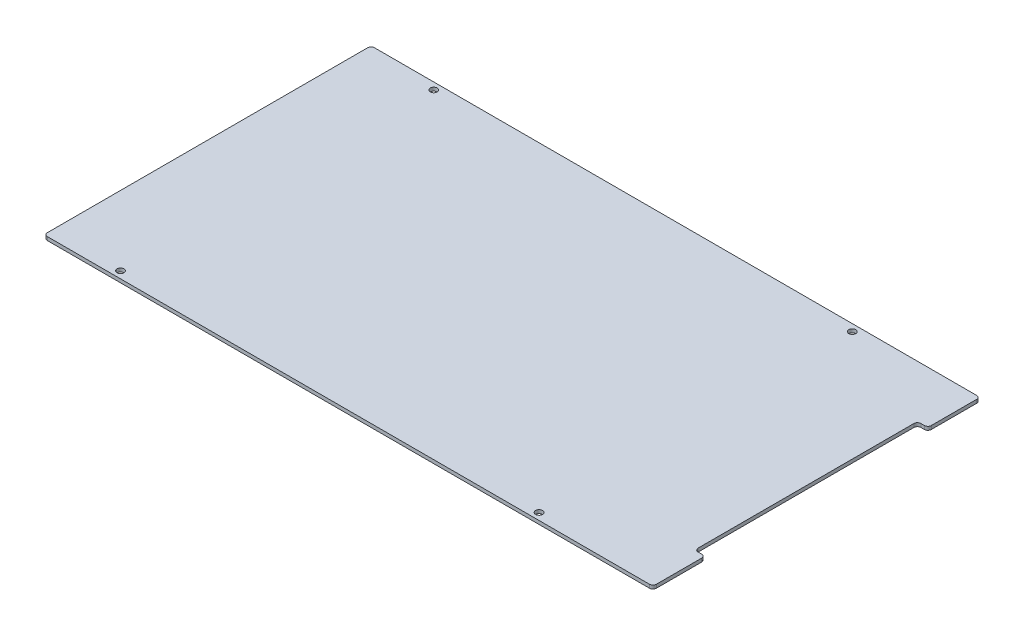
ISO-10303-21;
HEADER;
FILE_DESCRIPTION(('STEP AP214'),'2;1');
FILE_NAME('part.step','',(''),(''),'','','');
FILE_SCHEMA(('AUTOMOTIVE_DESIGN { 1 0 10303 214 1 1 1 1 }'));
ENDSEC;
DATA;
#1=APPLICATION_CONTEXT('core data for automotive mechanical design processes');
#2=APPLICATION_PROTOCOL_DEFINITION('international standard','automotive_design',2000,#1);
#3=PRODUCT_CONTEXT('',#1,'mechanical');
#4=PRODUCT('Part','Part','',(#3));
#5=PRODUCT_RELATED_PRODUCT_CATEGORY('part','',(#4));
#6=PRODUCT_DEFINITION_FORMATION('','',#4);
#7=PRODUCT_DEFINITION_CONTEXT('part definition',#1,'design');
#8=PRODUCT_DEFINITION('design','',#6,#7);
#9=PRODUCT_DEFINITION_SHAPE('','',#8);
#10=(LENGTH_UNIT() NAMED_UNIT(*) SI_UNIT(.MILLI.,.METRE.));
#11=(NAMED_UNIT(*) PLANE_ANGLE_UNIT() SI_UNIT($,.RADIAN.));
#12=(NAMED_UNIT(*) SI_UNIT($,.STERADIAN.) SOLID_ANGLE_UNIT());
#13=UNCERTAINTY_MEASURE_WITH_UNIT(LENGTH_MEASURE(1.E-05),#10,'distance_accuracy_value','');
#14=(GEOMETRIC_REPRESENTATION_CONTEXT(3) GLOBAL_UNCERTAINTY_ASSIGNED_CONTEXT((#13)) GLOBAL_UNIT_ASSIGNED_CONTEXT((#10,
#11,#12)) REPRESENTATION_CONTEXT('',''));
#15=CARTESIAN_POINT('',(0.,0.,0.));
#16=DIRECTION('',(0.,0.,1.));
#17=DIRECTION('',(1.,0.,0.));
#18=AXIS2_PLACEMENT_3D('',#15,#16,#17);
#19=CARTESIAN_POINT('',(277.8125,3.175,149.225));
#20=DIRECTION('',(-1.,0.,0.));
#21=DIRECTION('',(0.,0.,1.));
#22=AXIS2_PLACEMENT_3D('',#19,#20,#21);
#23=PLANE('',#22);
#24=DIRECTION('',(0.,0.,-1.));
#25=VECTOR('',#24,1.);
#26=CARTESIAN_POINT('',(277.8125,0.,149.225));
#27=LINE('',#26,#25);
#28=CARTESIAN_POINT('',(277.8125,0.,146.05));
#29=VERTEX_POINT('',#28);
#30=CARTESIAN_POINT('',(277.8125,0.,104.775));
#31=VERTEX_POINT('',#30);
#32=EDGE_CURVE('E205',#29,#31,#27,.T.);
#33=ORIENTED_EDGE('',*,*,#32,.T.);
#34=DIRECTION('',(0.,1.,0.));
#35=VECTOR('',#34,1.);
#36=CARTESIAN_POINT('',(277.8125,3.175,104.775));
#37=LINE('',#36,#35);
#38=CARTESIAN_POINT('',(277.8125,3.175,104.775));
#39=VERTEX_POINT('',#38);
#40=EDGE_CURVE('E258',#31,#39,#37,.T.);
#41=ORIENTED_EDGE('',*,*,#40,.T.);
#42=DIRECTION('',(0.,0.,-1.));
#43=VECTOR('',#42,1.);
#44=CARTESIAN_POINT('',(277.8125,3.175,149.225));
#45=LINE('',#44,#43);
#46=CARTESIAN_POINT('',(277.8125,3.175,146.05));
#47=VERTEX_POINT('',#46);
#48=EDGE_CURVE('E195',#47,#39,#45,.T.);
#49=ORIENTED_EDGE('',*,*,#48,.F.);
#50=DIRECTION('',(0.,-1.,0.));
#51=VECTOR('',#50,1.);
#52=CARTESIAN_POINT('',(277.8125,3.175,146.05));
#53=LINE('',#52,#51);
#54=EDGE_CURVE('E255',#47,#29,#53,.T.);
#55=ORIENTED_EDGE('',*,*,#54,.T.);
#56=EDGE_LOOP('',(#33,#41,#49,#55));
#57=FACE_BOUND('',#56,.T.);
#58=ADVANCED_FACE('F41',(#57),#23,.F.);
#59=CARTESIAN_POINT('',(277.8125,3.175,-104.775));
#60=VERTEX_POINT('',#59);
#61=CARTESIAN_POINT('',(277.8125,3.175,-146.05));
#62=VERTEX_POINT('',#61);
#63=EDGE_CURVE('E192',#60,#62,#45,.T.);
#64=ORIENTED_EDGE('',*,*,#63,.F.);
#65=DIRECTION('',(0.,1.,0.));
#66=VECTOR('',#65,1.);
#67=CARTESIAN_POINT('',(277.8125,3.175,-104.775));
#68=LINE('',#67,#66);
#69=CARTESIAN_POINT('',(277.8125,0.,-104.775));
#70=VERTEX_POINT('',#69);
#71=EDGE_CURVE('E243',#60,#70,#68,.F.);
#72=ORIENTED_EDGE('',*,*,#71,.T.);
#73=CARTESIAN_POINT('',(277.8125,0.,-146.05));
#74=VERTEX_POINT('',#73);
#75=EDGE_CURVE('E209',#70,#74,#27,.T.);
#76=ORIENTED_EDGE('',*,*,#75,.T.);
#77=DIRECTION('',(0.,-1.,0.));
#78=VECTOR('',#77,1.);
#79=CARTESIAN_POINT('',(277.8125,3.175,-146.05));
#80=LINE('',#79,#78);
#81=EDGE_CURVE('E241',#74,#62,#80,.F.);
#82=ORIENTED_EDGE('',*,*,#81,.T.);
#83=EDGE_LOOP('',(#64,#72,#76,#82));
#84=FACE_BOUND('',#83,.T.);
#85=ADVANCED_FACE('F308',(#84),#23,.F.);
#86=CARTESIAN_POINT('',(-277.8125,3.175,-149.225));
#87=DIRECTION('',(0.,0.,1.));
#88=DIRECTION('',(1.,0.,0.));
#89=AXIS2_PLACEMENT_3D('',#86,#87,#88);
#90=PLANE('',#89);
#91=DIRECTION('',(-1.,0.,0.));
#92=VECTOR('',#91,1.);
#93=CARTESIAN_POINT('',(-277.8125,3.175,-149.225));
#94=LINE('',#93,#92);
#95=CARTESIAN_POINT('',(274.6375,3.175,-149.225));
#96=VERTEX_POINT('',#95);
#97=CARTESIAN_POINT('',(-274.6375,3.175,-149.225));
#98=VERTEX_POINT('',#97);
#99=EDGE_CURVE('E197',#96,#98,#94,.T.);
#100=ORIENTED_EDGE('',*,*,#99,.F.);
#101=DIRECTION('',(0.,-1.,0.));
#102=VECTOR('',#101,1.);
#103=CARTESIAN_POINT('',(274.6375,3.175,-149.225));
#104=LINE('',#103,#102);
#105=CARTESIAN_POINT('',(274.6375,0.,-149.225));
#106=VERTEX_POINT('',#105);
#107=EDGE_CURVE('E265',#96,#106,#104,.T.);
#108=ORIENTED_EDGE('',*,*,#107,.T.);
#109=DIRECTION('',(-1.,0.,0.));
#110=VECTOR('',#109,1.);
#111=CARTESIAN_POINT('',(-277.8125,0.,-149.225));
#112=LINE('',#111,#110);
#113=CARTESIAN_POINT('',(-274.6375,0.,-149.225));
#114=VERTEX_POINT('',#113);
#115=EDGE_CURVE('E208',#106,#114,#112,.T.);
#116=ORIENTED_EDGE('',*,*,#115,.T.);
#117=DIRECTION('',(0.,-1.,0.));
#118=VECTOR('',#117,1.);
#119=CARTESIAN_POINT('',(-274.6375,3.175,-149.225));
#120=LINE('',#119,#118);
#121=EDGE_CURVE('E263',#114,#98,#120,.F.);
#122=ORIENTED_EDGE('',*,*,#121,.T.);
#123=EDGE_LOOP('',(#100,#108,#116,#122));
#124=FACE_BOUND('',#123,.T.);
#125=ADVANCED_FACE('F301',(#124),#90,.F.);
#126=CARTESIAN_POINT('',(-277.8125,3.175,149.225));
#127=DIRECTION('',(1.,0.,0.));
#128=DIRECTION('',(0.,0.,-1.));
#129=AXIS2_PLACEMENT_3D('',#126,#127,#128);
#130=PLANE('',#129);
#131=DIRECTION('',(0.,0.,1.));
#132=VECTOR('',#131,1.);
#133=CARTESIAN_POINT('',(-277.8125,3.175,149.225));
#134=LINE('',#133,#132);
#135=CARTESIAN_POINT('',(-277.8125,3.175,-146.05));
#136=VERTEX_POINT('',#135);
#137=CARTESIAN_POINT('',(-277.8125,3.175,146.05));
#138=VERTEX_POINT('',#137);
#139=EDGE_CURVE('E200',#136,#138,#134,.T.);
#140=ORIENTED_EDGE('',*,*,#139,.F.);
#141=DIRECTION('',(0.,-1.,0.));
#142=VECTOR('',#141,1.);
#143=CARTESIAN_POINT('',(-277.8125,3.175,-146.05));
#144=LINE('',#143,#142);
#145=CARTESIAN_POINT('',(-277.8125,0.,-146.05));
#146=VERTEX_POINT('',#145);
#147=EDGE_CURVE('E269',#136,#146,#144,.T.);
#148=ORIENTED_EDGE('',*,*,#147,.T.);
#149=DIRECTION('',(0.,0.,1.));
#150=VECTOR('',#149,1.);
#151=CARTESIAN_POINT('',(-277.8125,0.,149.225));
#152=LINE('',#151,#150);
#153=CARTESIAN_POINT('',(-277.8125,0.,146.05));
#154=VERTEX_POINT('',#153);
#155=EDGE_CURVE('E211',#146,#154,#152,.T.);
#156=ORIENTED_EDGE('',*,*,#155,.T.);
#157=DIRECTION('',(0.,-1.,0.));
#158=VECTOR('',#157,1.);
#159=CARTESIAN_POINT('',(-277.8125,3.175,146.05));
#160=LINE('',#159,#158);
#161=EDGE_CURVE('E267',#154,#138,#160,.F.);
#162=ORIENTED_EDGE('',*,*,#161,.T.);
#163=EDGE_LOOP('',(#140,#148,#156,#162));
#164=FACE_BOUND('',#163,.T.);
#165=ADVANCED_FACE('F293',(#164),#130,.F.);
#166=CARTESIAN_POINT('',(-277.8125,3.175,149.225));
#167=DIRECTION('',(0.,0.,-1.));
#168=DIRECTION('',(-1.,0.,0.));
#169=AXIS2_PLACEMENT_3D('',#166,#167,#168);
#170=PLANE('',#169);
#171=DIRECTION('',(1.,0.,0.));
#172=VECTOR('',#171,1.);
#173=CARTESIAN_POINT('',(-277.8125,0.,149.225));
#174=LINE('',#173,#172);
#175=CARTESIAN_POINT('',(-274.6375,0.,149.225));
#176=VERTEX_POINT('',#175);
#177=CARTESIAN_POINT('',(274.6375,0.,149.225));
#178=VERTEX_POINT('',#177);
#179=EDGE_CURVE('E196',#176,#178,#174,.T.);
#180=ORIENTED_EDGE('',*,*,#179,.T.);
#181=DIRECTION('',(0.,-1.,0.));
#182=VECTOR('',#181,1.);
#183=CARTESIAN_POINT('',(274.6375,3.175,149.225));
#184=LINE('',#183,#182);
#185=CARTESIAN_POINT('',(274.6375,3.175,149.225));
#186=VERTEX_POINT('',#185);
#187=EDGE_CURVE('E11',#178,#186,#184,.F.);
#188=ORIENTED_EDGE('',*,*,#187,.T.);
#189=DIRECTION('',(1.,0.,0.));
#190=VECTOR('',#189,1.);
#191=CARTESIAN_POINT('',(-277.8125,3.175,149.225));
#192=LINE('',#191,#190);
#193=CARTESIAN_POINT('',(-274.6375,3.175,149.225));
#194=VERTEX_POINT('',#193);
#195=EDGE_CURVE('E177',#194,#186,#192,.T.);
#196=ORIENTED_EDGE('',*,*,#195,.F.);
#197=DIRECTION('',(0.,-1.,0.));
#198=VECTOR('',#197,1.);
#199=CARTESIAN_POINT('',(-274.6375,3.175,149.225));
#200=LINE('',#199,#198);
#201=EDGE_CURVE('E49',#194,#176,#200,.T.);
#202=ORIENTED_EDGE('',*,*,#201,.T.);
#203=EDGE_LOOP('',(#180,#188,#196,#202));
#204=FACE_BOUND('',#203,.T.);
#205=ADVANCED_FACE('F276',(#204),#170,.F.);
#206=CARTESIAN_POINT('',(0.,3.175,0.));
#207=DIRECTION('',(0.,-1.,0.));
#208=DIRECTION('',(0.,0.,-1.));
#209=AXIS2_PLACEMENT_3D('',#206,#207,#208);
#210=PLANE('',#209);
#211=CARTESIAN_POINT('',(167.5765,3.175,-142.875));
#212=DIRECTION('',(0.,-1.,0.));
#213=DIRECTION('',(0.,0.,-1.));
#214=AXIS2_PLACEMENT_3D('',#211,#212,#213);
#215=CIRCLE('',#214,3.17500000000001);
#216=CARTESIAN_POINT('',(167.5765,3.175,-146.05));
#217=VERTEX_POINT('',#216);
#218=EDGE_CURVE('E336',#217,#217,#215,.T.);
#219=ORIENTED_EDGE('',*,*,#218,.T.);
#220=EDGE_LOOP('',(#219));
#221=FACE_BOUND('',#220,.T.);
#222=CARTESIAN_POINT('',(-214.3125,3.175,-142.875));
#223=DIRECTION('',(0.,-1.,0.));
#224=DIRECTION('',(0.,0.,-1.));
#225=AXIS2_PLACEMENT_3D('',#222,#223,#224);
#226=CIRCLE('',#225,3.17500000000001);
#227=CARTESIAN_POINT('',(-214.3125,3.175,-146.05));
#228=VERTEX_POINT('',#227);
#229=EDGE_CURVE('E330',#228,#228,#226,.T.);
#230=ORIENTED_EDGE('',*,*,#229,.T.);
#231=EDGE_LOOP('',(#230));
#232=FACE_BOUND('',#231,.T.);
#233=CARTESIAN_POINT('',(167.5765,3.175,142.875));
#234=DIRECTION('',(0.,-1.,0.));
#235=DIRECTION('',(0.,0.,-1.));
#236=AXIS2_PLACEMENT_3D('',#233,#234,#235);
#237=CIRCLE('',#236,3.17500000000001);
#238=CARTESIAN_POINT('',(167.5765,3.175,139.7));
#239=VERTEX_POINT('',#238);
#240=EDGE_CURVE('E322',#239,#239,#237,.T.);
#241=ORIENTED_EDGE('',*,*,#240,.T.);
#242=EDGE_LOOP('',(#241));
#243=FACE_BOUND('',#242,.T.);
#244=CARTESIAN_POINT('',(-214.3125,3.175,142.875));
#245=DIRECTION('',(0.,-1.,0.));
#246=DIRECTION('',(0.,0.,-1.));
#247=AXIS2_PLACEMENT_3D('',#244,#245,#246);
#248=CIRCLE('',#247,3.17500000000001);
#249=CARTESIAN_POINT('',(-214.3125,3.175,139.7));
#250=VERTEX_POINT('',#249);
#251=EDGE_CURVE('E314',#250,#250,#248,.T.);
#252=ORIENTED_EDGE('',*,*,#251,.T.);
#253=EDGE_LOOP('',(#252));
#254=FACE_BOUND('',#253,.T.);
#255=DIRECTION('',(-1.,0.,0.));
#256=VECTOR('',#255,1.);
#257=CARTESIAN_POINT('',(277.8125,3.175,-101.6));
#258=LINE('',#257,#256);
#259=CARTESIAN_POINT('',(274.6375,3.175,-101.6));
#260=VERTEX_POINT('',#259);
#261=CARTESIAN_POINT('',(271.4625,3.175,-101.6));
#262=VERTEX_POINT('',#261);
#263=EDGE_CURVE('E188',#260,#262,#258,.T.);
#264=ORIENTED_EDGE('',*,*,#263,.F.);
#265=CARTESIAN_POINT('',(274.6375,3.175,-104.775));
#266=DIRECTION('',(0.,-1.,0.));
#267=DIRECTION('',(0.,0.,-1.));
#268=AXIS2_PLACEMENT_3D('',#265,#266,#267);
#269=CIRCLE('',#268,3.175);
#270=EDGE_CURVE('E239',#260,#60,#269,.F.);
#271=ORIENTED_EDGE('',*,*,#270,.T.);
#272=ORIENTED_EDGE('',*,*,#63,.T.);
#273=CARTESIAN_POINT('',(274.6375,3.175,-146.05));
#274=DIRECTION('',(0.,-1.,0.));
#275=DIRECTION('',(0.,0.,-1.));
#276=AXIS2_PLACEMENT_3D('',#273,#274,#275);
#277=CIRCLE('',#276,3.175);
#278=EDGE_CURVE('E236',#62,#96,#277,.F.);
#279=ORIENTED_EDGE('',*,*,#278,.T.);
#280=ORIENTED_EDGE('',*,*,#99,.T.);
#281=CARTESIAN_POINT('',(-274.6375,3.175,-146.05));
#282=DIRECTION('',(0.,-1.,0.));
#283=DIRECTION('',(0.,0.,-1.));
#284=AXIS2_PLACEMENT_3D('',#281,#282,#283);
#285=CIRCLE('',#284,3.175);
#286=EDGE_CURVE('E234',#98,#136,#285,.F.);
#287=ORIENTED_EDGE('',*,*,#286,.T.);
#288=ORIENTED_EDGE('',*,*,#139,.T.);
#289=CARTESIAN_POINT('',(-274.6375,3.175,146.05));
#290=DIRECTION('',(0.,-1.,0.));
#291=DIRECTION('',(0.,0.,-1.));
#292=AXIS2_PLACEMENT_3D('',#289,#290,#291);
#293=CIRCLE('',#292,3.175);
#294=EDGE_CURVE('E230',#138,#194,#293,.F.);
#295=ORIENTED_EDGE('',*,*,#294,.T.);
#296=ORIENTED_EDGE('',*,*,#195,.T.);
#297=CARTESIAN_POINT('',(274.6375,3.175,146.05));
#298=DIRECTION('',(0.,-1.,0.));
#299=DIRECTION('',(0.,0.,-1.));
#300=AXIS2_PLACEMENT_3D('',#297,#298,#299);
#301=CIRCLE('',#300,3.175);
#302=EDGE_CURVE('E232',#186,#47,#301,.F.);
#303=ORIENTED_EDGE('',*,*,#302,.T.);
#304=ORIENTED_EDGE('',*,*,#48,.T.);
#305=CARTESIAN_POINT('',(274.6375,3.175,104.775));
#306=DIRECTION('',(0.,-1.,0.));
#307=DIRECTION('',(0.,0.,-1.));
#308=AXIS2_PLACEMENT_3D('',#305,#306,#307);
#309=CIRCLE('',#308,3.175);
#310=CARTESIAN_POINT('',(274.6375,3.175,101.6));
#311=VERTEX_POINT('',#310);
#312=EDGE_CURVE('E182',#39,#311,#309,.F.);
#313=ORIENTED_EDGE('',*,*,#312,.T.);
#314=DIRECTION('',(1.,0.,0.));
#315=VECTOR('',#314,1.);
#316=CARTESIAN_POINT('',(277.8125,3.175,101.6));
#317=LINE('',#316,#315);
#318=CARTESIAN_POINT('',(271.4625,3.175,101.6));
#319=VERTEX_POINT('',#318);
#320=EDGE_CURVE('E172',#319,#311,#317,.T.);
#321=ORIENTED_EDGE('',*,*,#320,.F.);
#322=CARTESIAN_POINT('',(271.4625,3.175,98.425));
#323=DIRECTION('',(0.,-1.,0.));
#324=DIRECTION('',(0.,0.,-1.));
#325=AXIS2_PLACEMENT_3D('',#322,#323,#324);
#326=CIRCLE('',#325,3.175);
#327=CARTESIAN_POINT('',(268.2875,3.175,98.425));
#328=VERTEX_POINT('',#327);
#329=EDGE_CURVE('E155',#319,#328,#326,.T.);
#330=ORIENTED_EDGE('',*,*,#329,.T.);
#331=DIRECTION('',(0.,0.,1.));
#332=VECTOR('',#331,1.);
#333=CARTESIAN_POINT('',(268.2875,3.175,-101.6));
#334=LINE('',#333,#332);
#335=CARTESIAN_POINT('',(268.2875,3.175,-98.425));
#336=VERTEX_POINT('',#335);
#337=EDGE_CURVE('E184',#336,#328,#334,.T.);
#338=ORIENTED_EDGE('',*,*,#337,.F.);
#339=CARTESIAN_POINT('',(271.4625,3.175,-98.425));
#340=DIRECTION('',(0.,-1.,0.));
#341=DIRECTION('',(0.,0.,-1.));
#342=AXIS2_PLACEMENT_3D('',#339,#340,#341);
#343=CIRCLE('',#342,3.175);
#344=EDGE_CURVE('E222',#336,#262,#343,.T.);
#345=ORIENTED_EDGE('',*,*,#344,.T.);
#346=EDGE_LOOP('',(#264,#271,#272,#279,#280,#287,#288,#295,#296,#303,#304,#313,#321,#330,#338,#345));
#347=FACE_BOUND('',#346,.T.);
#348=ADVANCED_FACE('F180',(#221,#232,#243,#254,#347),#210,.F.);
#349=CARTESIAN_POINT('',(0.,0.,0.));
#350=DIRECTION('',(0.,-1.,0.));
#351=DIRECTION('',(0.,0.,-1.));
#352=AXIS2_PLACEMENT_3D('',#349,#350,#351);
#353=PLANE('',#352);
#354=CARTESIAN_POINT('',(167.5765,0.,-142.875));
#355=DIRECTION('',(0.,-1.,0.));
#356=DIRECTION('',(0.,0.,-1.));
#357=AXIS2_PLACEMENT_3D('',#354,#355,#356);
#358=CIRCLE('',#357,3.17499999999998);
#359=CARTESIAN_POINT('',(167.5765,0.,-146.05));
#360=VERTEX_POINT('',#359);
#361=EDGE_CURVE('E339',#360,#360,#358,.T.);
#362=ORIENTED_EDGE('',*,*,#361,.F.);
#363=EDGE_LOOP('',(#362));
#364=FACE_BOUND('',#363,.T.);
#365=CARTESIAN_POINT('',(-214.3125,0.,-142.875));
#366=DIRECTION('',(0.,-1.,0.));
#367=DIRECTION('',(0.,0.,-1.));
#368=AXIS2_PLACEMENT_3D('',#365,#366,#367);
#369=CIRCLE('',#368,3.17499999999998);
#370=CARTESIAN_POINT('',(-214.3125,0.,-146.05));
#371=VERTEX_POINT('',#370);
#372=EDGE_CURVE('E333',#371,#371,#369,.T.);
#373=ORIENTED_EDGE('',*,*,#372,.F.);
#374=EDGE_LOOP('',(#373));
#375=FACE_BOUND('',#374,.T.);
#376=CARTESIAN_POINT('',(167.5765,0.,142.875));
#377=DIRECTION('',(0.,-1.,0.));
#378=DIRECTION('',(0.,0.,-1.));
#379=AXIS2_PLACEMENT_3D('',#376,#377,#378);
#380=CIRCLE('',#379,3.17499999999998);
#381=CARTESIAN_POINT('',(167.5765,0.,139.7));
#382=VERTEX_POINT('',#381);
#383=EDGE_CURVE('E327',#382,#382,#380,.T.);
#384=ORIENTED_EDGE('',*,*,#383,.F.);
#385=EDGE_LOOP('',(#384));
#386=FACE_BOUND('',#385,.T.);
#387=CARTESIAN_POINT('',(-214.3125,0.,142.875));
#388=DIRECTION('',(0.,-1.,0.));
#389=DIRECTION('',(0.,0.,-1.));
#390=AXIS2_PLACEMENT_3D('',#387,#388,#389);
#391=CIRCLE('',#390,3.17499999999998);
#392=CARTESIAN_POINT('',(-214.3125,0.,139.7));
#393=VERTEX_POINT('',#392);
#394=EDGE_CURVE('E317',#393,#393,#391,.T.);
#395=ORIENTED_EDGE('',*,*,#394,.F.);
#396=EDGE_LOOP('',(#395));
#397=FACE_BOUND('',#396,.T.);
#398=ORIENTED_EDGE('',*,*,#75,.F.);
#399=CARTESIAN_POINT('',(274.6375,0.,-104.775));
#400=DIRECTION('',(0.,-1.,0.));
#401=DIRECTION('',(0.,0.,-1.));
#402=AXIS2_PLACEMENT_3D('',#399,#400,#401);
#403=CIRCLE('',#402,3.175);
#404=CARTESIAN_POINT('',(274.6375,0.,-101.6));
#405=VERTEX_POINT('',#404);
#406=EDGE_CURVE('E253',#70,#405,#403,.T.);
#407=ORIENTED_EDGE('',*,*,#406,.T.);
#408=DIRECTION('',(-1.,0.,0.));
#409=VECTOR('',#408,1.);
#410=CARTESIAN_POINT('',(277.8125,0.,-101.6));
#411=LINE('',#410,#409);
#412=CARTESIAN_POINT('',(271.4625,0.,-101.6));
#413=VERTEX_POINT('',#412);
#414=EDGE_CURVE('E183',#405,#413,#411,.T.);
#415=ORIENTED_EDGE('',*,*,#414,.T.);
#416=CARTESIAN_POINT('',(271.4625,0.,-98.425));
#417=DIRECTION('',(0.,-1.,0.));
#418=DIRECTION('',(0.,0.,-1.));
#419=AXIS2_PLACEMENT_3D('',#416,#417,#418);
#420=CIRCLE('',#419,3.175);
#421=CARTESIAN_POINT('',(268.2875,0.,-98.425));
#422=VERTEX_POINT('',#421);
#423=EDGE_CURVE('E225',#413,#422,#420,.F.);
#424=ORIENTED_EDGE('',*,*,#423,.T.);
#425=DIRECTION('',(0.,0.,1.));
#426=VECTOR('',#425,1.);
#427=CARTESIAN_POINT('',(268.2875,0.,-101.6));
#428=LINE('',#427,#426);
#429=CARTESIAN_POINT('',(268.2875,0.,98.425));
#430=VERTEX_POINT('',#429);
#431=EDGE_CURVE('E186',#422,#430,#428,.T.);
#432=ORIENTED_EDGE('',*,*,#431,.T.);
#433=CARTESIAN_POINT('',(271.4625,0.,98.425));
#434=DIRECTION('',(0.,-1.,0.));
#435=DIRECTION('',(0.,0.,-1.));
#436=AXIS2_PLACEMENT_3D('',#433,#434,#435);
#437=CIRCLE('',#436,3.175);
#438=CARTESIAN_POINT('',(271.4625,0.,101.6));
#439=VERTEX_POINT('',#438);
#440=EDGE_CURVE('E165',#430,#439,#437,.F.);
#441=ORIENTED_EDGE('',*,*,#440,.T.);
#442=DIRECTION('',(1.,0.,0.));
#443=VECTOR('',#442,1.);
#444=CARTESIAN_POINT('',(277.8125,0.,101.6));
#445=LINE('',#444,#443);
#446=CARTESIAN_POINT('',(274.6375,0.,101.6));
#447=VERTEX_POINT('',#446);
#448=EDGE_CURVE('E175',#439,#447,#445,.T.);
#449=ORIENTED_EDGE('',*,*,#448,.T.);
#450=CARTESIAN_POINT('',(274.6375,0.,104.775));
#451=DIRECTION('',(0.,-1.,0.));
#452=DIRECTION('',(0.,0.,-1.));
#453=AXIS2_PLACEMENT_3D('',#450,#451,#452);
#454=CIRCLE('',#453,3.175);
#455=EDGE_CURVE('E251',#447,#31,#454,.T.);
#456=ORIENTED_EDGE('',*,*,#455,.T.);
#457=ORIENTED_EDGE('',*,*,#32,.F.);
#458=CARTESIAN_POINT('',(274.6375,0.,146.05));
#459=DIRECTION('',(0.,-1.,0.));
#460=DIRECTION('',(0.,0.,-1.));
#461=AXIS2_PLACEMENT_3D('',#458,#459,#460);
#462=CIRCLE('',#461,3.175);
#463=EDGE_CURVE('E247',#29,#178,#462,.T.);
#464=ORIENTED_EDGE('',*,*,#463,.T.);
#465=ORIENTED_EDGE('',*,*,#179,.F.);
#466=CARTESIAN_POINT('',(-274.6375,0.,146.05));
#467=DIRECTION('',(0.,-1.,0.));
#468=DIRECTION('',(0.,0.,-1.));
#469=AXIS2_PLACEMENT_3D('',#466,#467,#468);
#470=CIRCLE('',#469,3.175);
#471=EDGE_CURVE('E245',#176,#154,#470,.T.);
#472=ORIENTED_EDGE('',*,*,#471,.T.);
#473=ORIENTED_EDGE('',*,*,#155,.F.);
#474=CARTESIAN_POINT('',(-274.6375,0.,-146.05));
#475=DIRECTION('',(0.,-1.,0.));
#476=DIRECTION('',(0.,0.,-1.));
#477=AXIS2_PLACEMENT_3D('',#474,#475,#476);
#478=CIRCLE('',#477,3.175);
#479=EDGE_CURVE('E56',#146,#114,#478,.T.);
#480=ORIENTED_EDGE('',*,*,#479,.T.);
#481=ORIENTED_EDGE('',*,*,#115,.F.);
#482=CARTESIAN_POINT('',(274.6375,0.,-146.05));
#483=DIRECTION('',(0.,-1.,0.));
#484=DIRECTION('',(0.,0.,-1.));
#485=AXIS2_PLACEMENT_3D('',#482,#483,#484);
#486=CIRCLE('',#485,3.175);
#487=EDGE_CURVE('E64',#106,#74,#486,.T.);
#488=ORIENTED_EDGE('',*,*,#487,.T.);
#489=EDGE_LOOP('',(#398,#407,#415,#424,#432,#441,#449,#456,#457,#464,#465,#472,#473,#480,#481,#488));
#490=FACE_BOUND('',#489,.T.);
#491=ADVANCED_FACE('F281',(#364,#375,#386,#397,#490),#353,.T.);
#492=CARTESIAN_POINT('',(277.8125,0.,101.6));
#493=DIRECTION('',(0.,0.,1.));
#494=DIRECTION('',(1.,0.,0.));
#495=AXIS2_PLACEMENT_3D('',#492,#493,#494);
#496=PLANE('',#495);
#497=ORIENTED_EDGE('',*,*,#320,.T.);
#498=DIRECTION('',(0.,1.,0.));
#499=VECTOR('',#498,1.);
#500=CARTESIAN_POINT('',(274.6375,0.,101.6));
#501=LINE('',#500,#499);
#502=EDGE_CURVE('E261',#311,#447,#501,.F.);
#503=ORIENTED_EDGE('',*,*,#502,.T.);
#504=ORIENTED_EDGE('',*,*,#448,.F.);
#505=DIRECTION('',(0.,1.,0.));
#506=VECTOR('',#505,1.);
#507=CARTESIAN_POINT('',(271.4625,3.175,101.6));
#508=LINE('',#507,#506);
#509=EDGE_CURVE('E159',#439,#319,#508,.T.);
#510=ORIENTED_EDGE('',*,*,#509,.T.);
#511=EDGE_LOOP('',(#497,#503,#504,#510));
#512=FACE_BOUND('',#511,.T.);
#513=ADVANCED_FACE('F171',(#512),#496,.F.);
#514=CARTESIAN_POINT('',(268.2875,0.,-101.6));
#515=DIRECTION('',(-1.,0.,0.));
#516=DIRECTION('',(0.,0.,1.));
#517=AXIS2_PLACEMENT_3D('',#514,#515,#516);
#518=PLANE('',#517);
#519=ORIENTED_EDGE('',*,*,#337,.T.);
#520=DIRECTION('',(0.,1.,0.));
#521=VECTOR('',#520,1.);
#522=CARTESIAN_POINT('',(268.2875,0.,98.425));
#523=LINE('',#522,#521);
#524=EDGE_CURVE('E160',#328,#430,#523,.F.);
#525=ORIENTED_EDGE('',*,*,#524,.T.);
#526=ORIENTED_EDGE('',*,*,#431,.F.);
#527=DIRECTION('',(0.,1.,0.));
#528=VECTOR('',#527,1.);
#529=CARTESIAN_POINT('',(268.2875,3.175,-98.425));
#530=LINE('',#529,#528);
#531=EDGE_CURVE('E176',#422,#336,#530,.T.);
#532=ORIENTED_EDGE('',*,*,#531,.T.);
#533=EDGE_LOOP('',(#519,#525,#526,#532));
#534=FACE_BOUND('',#533,.T.);
#535=ADVANCED_FACE('F452',(#534),#518,.F.);
#536=CARTESIAN_POINT('',(277.8125,0.,-101.6));
#537=DIRECTION('',(0.,0.,-1.));
#538=DIRECTION('',(-1.,0.,0.));
#539=AXIS2_PLACEMENT_3D('',#536,#537,#538);
#540=PLANE('',#539);
#541=ORIENTED_EDGE('',*,*,#414,.F.);
#542=DIRECTION('',(0.,1.,0.));
#543=VECTOR('',#542,1.);
#544=CARTESIAN_POINT('',(274.6375,0.,-101.6));
#545=LINE('',#544,#543);
#546=EDGE_CURVE('E227',#405,#260,#545,.T.);
#547=ORIENTED_EDGE('',*,*,#546,.T.);
#548=ORIENTED_EDGE('',*,*,#263,.T.);
#549=DIRECTION('',(0.,1.,0.));
#550=VECTOR('',#549,1.);
#551=CARTESIAN_POINT('',(271.4625,0.,-101.6));
#552=LINE('',#551,#550);
#553=EDGE_CURVE('E166',#262,#413,#552,.F.);
#554=ORIENTED_EDGE('',*,*,#553,.T.);
#555=EDGE_LOOP('',(#541,#547,#548,#554));
#556=FACE_BOUND('',#555,.T.);
#557=ADVANCED_FACE('F380',(#556),#540,.F.);
#558=CARTESIAN_POINT('',(271.4625,0.,98.425));
#559=DIRECTION('',(0.,-1.,0.));
#560=DIRECTION('',(0.,0.,-1.));
#561=AXIS2_PLACEMENT_3D('',#558,#559,#560);
#562=CYLINDRICAL_SURFACE('',#561,3.175);
#563=ORIENTED_EDGE('',*,*,#440,.F.);
#564=ORIENTED_EDGE('',*,*,#524,.F.);
#565=ORIENTED_EDGE('',*,*,#329,.F.);
#566=ORIENTED_EDGE('',*,*,#509,.F.);
#567=EDGE_LOOP('',(#563,#564,#565,#566));
#568=FACE_BOUND('',#567,.T.);
#569=ADVANCED_FACE('F158',(#568),#562,.F.);
#570=CARTESIAN_POINT('',(271.4625,0.,-98.425));
#571=DIRECTION('',(0.,-1.,0.));
#572=DIRECTION('',(0.,0.,-1.));
#573=AXIS2_PLACEMENT_3D('',#570,#571,#572);
#574=CYLINDRICAL_SURFACE('',#573,3.175);
#575=ORIENTED_EDGE('',*,*,#423,.F.);
#576=ORIENTED_EDGE('',*,*,#553,.F.);
#577=ORIENTED_EDGE('',*,*,#344,.F.);
#578=ORIENTED_EDGE('',*,*,#531,.F.);
#579=EDGE_LOOP('',(#575,#576,#577,#578));
#580=FACE_BOUND('',#579,.T.);
#581=ADVANCED_FACE('F357',(#580),#574,.F.);
#582=CARTESIAN_POINT('',(-214.3125,0.,142.875));
#583=DIRECTION('',(0.,-1.,0.));
#584=DIRECTION('',(0.,0.,-1.));
#585=AXIS2_PLACEMENT_3D('',#582,#583,#584);
#586=CYLINDRICAL_SURFACE('',#585,3.175);
#587=ORIENTED_EDGE('',*,*,#251,.F.);
#588=EDGE_LOOP('',(#587));
#589=FACE_BOUND('',#588,.T.);
#590=ORIENTED_EDGE('',*,*,#394,.T.);
#591=EDGE_LOOP('',(#590));
#592=FACE_BOUND('',#591,.T.);
#593=ADVANCED_FACE('F354',(#589,#592),#586,.F.);
#594=CARTESIAN_POINT('',(167.5765,0.,142.875));
#595=DIRECTION('',(0.,-1.,0.));
#596=DIRECTION('',(0.,0.,-1.));
#597=AXIS2_PLACEMENT_3D('',#594,#595,#596);
#598=CYLINDRICAL_SURFACE('',#597,3.175);
#599=ORIENTED_EDGE('',*,*,#240,.F.);
#600=EDGE_LOOP('',(#599));
#601=FACE_BOUND('',#600,.T.);
#602=ORIENTED_EDGE('',*,*,#383,.T.);
#603=EDGE_LOOP('',(#602));
#604=FACE_BOUND('',#603,.T.);
#605=ADVANCED_FACE('F356',(#601,#604),#598,.F.);
#606=CARTESIAN_POINT('',(-214.3125,0.,-142.875));
#607=DIRECTION('',(0.,-1.,0.));
#608=DIRECTION('',(0.,0.,-1.));
#609=AXIS2_PLACEMENT_3D('',#606,#607,#608);
#610=CYLINDRICAL_SURFACE('',#609,3.175);
#611=ORIENTED_EDGE('',*,*,#229,.F.);
#612=EDGE_LOOP('',(#611));
#613=FACE_BOUND('',#612,.T.);
#614=ORIENTED_EDGE('',*,*,#372,.T.);
#615=EDGE_LOOP('',(#614));
#616=FACE_BOUND('',#615,.T.);
#617=ADVANCED_FACE('F364',(#613,#616),#610,.F.);
#618=CARTESIAN_POINT('',(167.5765,0.,-142.875));
#619=DIRECTION('',(0.,-1.,0.));
#620=DIRECTION('',(0.,0.,-1.));
#621=AXIS2_PLACEMENT_3D('',#618,#619,#620);
#622=CYLINDRICAL_SURFACE('',#621,3.175);
#623=ORIENTED_EDGE('',*,*,#218,.F.);
#624=EDGE_LOOP('',(#623));
#625=FACE_BOUND('',#624,.T.);
#626=ORIENTED_EDGE('',*,*,#361,.T.);
#627=EDGE_LOOP('',(#626));
#628=FACE_BOUND('',#627,.T.);
#629=ADVANCED_FACE('F343',(#625,#628),#622,.F.);
#630=CARTESIAN_POINT('',(274.6375,0.,-104.775));
#631=DIRECTION('',(0.,1.,0.));
#632=DIRECTION('',(0.,0.,1.));
#633=AXIS2_PLACEMENT_3D('',#630,#631,#632);
#634=CYLINDRICAL_SURFACE('',#633,3.175);
#635=ORIENTED_EDGE('',*,*,#406,.F.);
#636=ORIENTED_EDGE('',*,*,#71,.F.);
#637=ORIENTED_EDGE('',*,*,#270,.F.);
#638=ORIENTED_EDGE('',*,*,#546,.F.);
#639=EDGE_LOOP('',(#635,#636,#637,#638));
#640=FACE_BOUND('',#639,.T.);
#641=ADVANCED_FACE('F382',(#640),#634,.T.);
#642=CARTESIAN_POINT('',(274.6375,3.175,104.775));
#643=DIRECTION('',(0.,1.,0.));
#644=DIRECTION('',(0.,0.,1.));
#645=AXIS2_PLACEMENT_3D('',#642,#643,#644);
#646=CYLINDRICAL_SURFACE('',#645,3.175);
#647=ORIENTED_EDGE('',*,*,#455,.F.);
#648=ORIENTED_EDGE('',*,*,#502,.F.);
#649=ORIENTED_EDGE('',*,*,#312,.F.);
#650=ORIENTED_EDGE('',*,*,#40,.F.);
#651=EDGE_LOOP('',(#647,#648,#649,#650));
#652=FACE_BOUND('',#651,.T.);
#653=ADVANCED_FACE('F385',(#652),#646,.T.);
#654=CARTESIAN_POINT('',(274.6375,3.175,-146.05));
#655=DIRECTION('',(0.,-1.,0.));
#656=DIRECTION('',(0.,0.,-1.));
#657=AXIS2_PLACEMENT_3D('',#654,#655,#656);
#658=CYLINDRICAL_SURFACE('',#657,3.175);
#659=ORIENTED_EDGE('',*,*,#278,.F.);
#660=ORIENTED_EDGE('',*,*,#81,.F.);
#661=ORIENTED_EDGE('',*,*,#487,.F.);
#662=ORIENTED_EDGE('',*,*,#107,.F.);
#663=EDGE_LOOP('',(#659,#660,#661,#662));
#664=FACE_BOUND('',#663,.T.);
#665=ADVANCED_FACE('F304',(#664),#658,.T.);
#666=CARTESIAN_POINT('',(-274.6375,3.175,-146.05));
#667=DIRECTION('',(0.,-1.,0.));
#668=DIRECTION('',(0.,0.,-1.));
#669=AXIS2_PLACEMENT_3D('',#666,#667,#668);
#670=CYLINDRICAL_SURFACE('',#669,3.175);
#671=ORIENTED_EDGE('',*,*,#286,.F.);
#672=ORIENTED_EDGE('',*,*,#121,.F.);
#673=ORIENTED_EDGE('',*,*,#479,.F.);
#674=ORIENTED_EDGE('',*,*,#147,.F.);
#675=EDGE_LOOP('',(#671,#672,#673,#674));
#676=FACE_BOUND('',#675,.T.);
#677=ADVANCED_FACE('F297',(#676),#670,.T.);
#678=CARTESIAN_POINT('',(274.6375,3.175,146.05));
#679=DIRECTION('',(0.,-1.,0.));
#680=DIRECTION('',(0.,0.,-1.));
#681=AXIS2_PLACEMENT_3D('',#678,#679,#680);
#682=CYLINDRICAL_SURFACE('',#681,3.175);
#683=ORIENTED_EDGE('',*,*,#302,.F.);
#684=ORIENTED_EDGE('',*,*,#187,.F.);
#685=ORIENTED_EDGE('',*,*,#463,.F.);
#686=ORIENTED_EDGE('',*,*,#54,.F.);
#687=EDGE_LOOP('',(#683,#684,#685,#686));
#688=FACE_BOUND('',#687,.T.);
#689=ADVANCED_FACE('F286',(#688),#682,.T.);
#690=CARTESIAN_POINT('',(-274.6375,3.175,146.05));
#691=DIRECTION('',(0.,-1.,0.));
#692=DIRECTION('',(0.,0.,-1.));
#693=AXIS2_PLACEMENT_3D('',#690,#691,#692);
#694=CYLINDRICAL_SURFACE('',#693,3.175);
#695=ORIENTED_EDGE('',*,*,#294,.F.);
#696=ORIENTED_EDGE('',*,*,#161,.F.);
#697=ORIENTED_EDGE('',*,*,#471,.F.);
#698=ORIENTED_EDGE('',*,*,#201,.F.);
#699=EDGE_LOOP('',(#695,#696,#697,#698));
#700=FACE_BOUND('',#699,.T.);
#701=ADVANCED_FACE('F43',(#700),#694,.T.);
#702=CLOSED_SHELL('',(#58,#85,#125,#165,#205,#348,#491,#513,#535,#557,#569,#581,#593,#605,#617,
#629,#641,#653,#665,#677,#689,#701));
#703=MANIFOLD_SOLID_BREP('B2',#702);
#704=ADVANCED_BREP_SHAPE_REPRESENTATION('',(#18,#703),#14);
#705=SHAPE_DEFINITION_REPRESENTATION(#9,#704);
ENDSEC;
END-ISO-10303-21;
